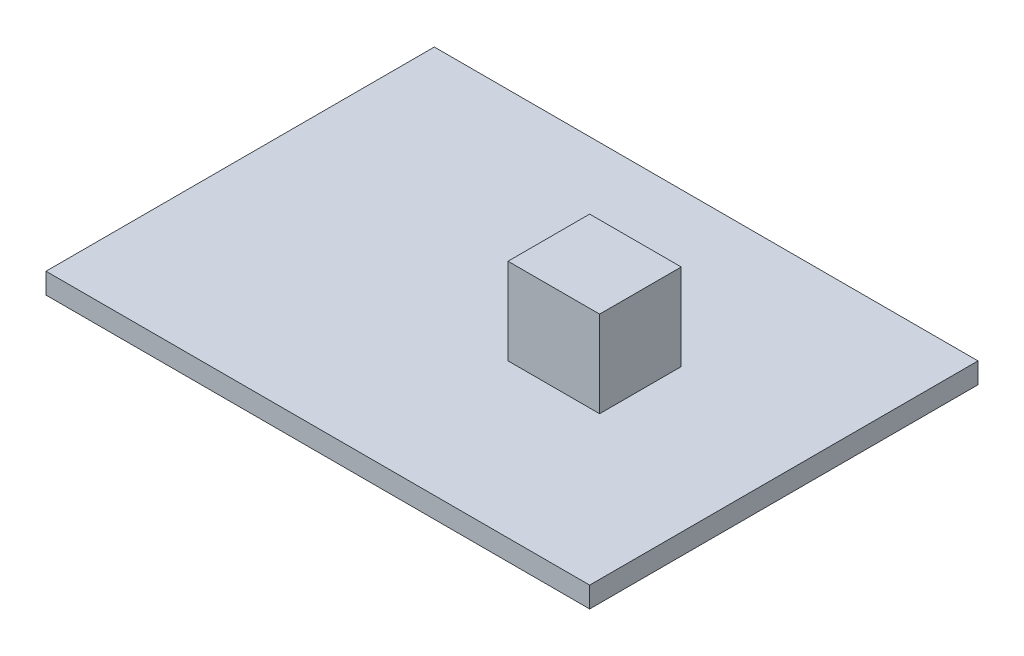
ISO-10303-21;
HEADER;
FILE_DESCRIPTION(('STEP AP214'),'2;1');
FILE_NAME('part.step','',(''),(''),'','','');
FILE_SCHEMA(('AUTOMOTIVE_DESIGN { 1 0 10303 214 1 1 1 1 }'));
ENDSEC;
DATA;
#1=APPLICATION_CONTEXT('core data for automotive mechanical design processes');
#2=APPLICATION_PROTOCOL_DEFINITION('international standard','automotive_design',2000,#1);
#3=PRODUCT_CONTEXT('',#1,'mechanical');
#4=PRODUCT('Part','Part','',(#3));
#5=PRODUCT_RELATED_PRODUCT_CATEGORY('part','',(#4));
#6=PRODUCT_DEFINITION_FORMATION('','',#4);
#7=PRODUCT_DEFINITION_CONTEXT('part definition',#1,'design');
#8=PRODUCT_DEFINITION('design','',#6,#7);
#9=PRODUCT_DEFINITION_SHAPE('','',#8);
#10=(LENGTH_UNIT() NAMED_UNIT(*) SI_UNIT(.MILLI.,.METRE.));
#11=(NAMED_UNIT(*) PLANE_ANGLE_UNIT() SI_UNIT($,.RADIAN.));
#12=(NAMED_UNIT(*) SI_UNIT($,.STERADIAN.) SOLID_ANGLE_UNIT());
#13=UNCERTAINTY_MEASURE_WITH_UNIT(LENGTH_MEASURE(1.E-05),#10,'distance_accuracy_value','');
#14=(GEOMETRIC_REPRESENTATION_CONTEXT(3) GLOBAL_UNCERTAINTY_ASSIGNED_CONTEXT((#13)) GLOBAL_UNIT_ASSIGNED_CONTEXT((#10,
#11,#12)) REPRESENTATION_CONTEXT('',''));
#15=CARTESIAN_POINT('',(0.,0.,0.));
#16=DIRECTION('',(0.,0.,1.));
#17=DIRECTION('',(1.,0.,0.));
#18=AXIS2_PLACEMENT_3D('',#15,#16,#17);
#19=CARTESIAN_POINT('',(-35.9213114754098,2.4,-23.));
#20=DIRECTION('',(1.,0.,0.));
#21=DIRECTION('',(0.,0.,-1.));
#22=AXIS2_PLACEMENT_3D('',#19,#20,#21);
#23=PLANE('',#22);
#24=DIRECTION('',(0.,0.,1.));
#25=VECTOR('',#24,1.);
#26=CARTESIAN_POINT('',(-35.9213114754098,0.,-23.));
#27=LINE('',#26,#25);
#28=CARTESIAN_POINT('',(-35.9213114754098,0.,-23.));
#29=VERTEX_POINT('',#28);
#30=CARTESIAN_POINT('',(-35.9213114754098,0.,22.));
#31=VERTEX_POINT('',#30);
#32=EDGE_CURVE('E117',#29,#31,#27,.T.);
#33=ORIENTED_EDGE('',*,*,#32,.T.);
#34=DIRECTION('',(0.,-1.,0.));
#35=VECTOR('',#34,1.);
#36=CARTESIAN_POINT('',(-35.9213114754098,2.4,22.));
#37=LINE('',#36,#35);
#38=CARTESIAN_POINT('',(-35.9213114754098,2.4,22.));
#39=VERTEX_POINT('',#38);
#40=EDGE_CURVE('E11',#39,#31,#37,.T.);
#41=ORIENTED_EDGE('',*,*,#40,.F.);
#42=DIRECTION('',(0.,0.,1.));
#43=VECTOR('',#42,1.);
#44=CARTESIAN_POINT('',(-35.9213114754098,2.4,-23.));
#45=LINE('',#44,#43);
#46=CARTESIAN_POINT('',(-35.9213114754098,2.4,-23.));
#47=VERTEX_POINT('',#46);
#48=EDGE_CURVE('E126',#47,#39,#45,.T.);
#49=ORIENTED_EDGE('',*,*,#48,.F.);
#50=DIRECTION('',(0.,-1.,0.));
#51=VECTOR('',#50,1.);
#52=CARTESIAN_POINT('',(-35.9213114754098,2.4,-23.));
#53=LINE('',#52,#51);
#54=EDGE_CURVE('E135',#47,#29,#53,.T.);
#55=ORIENTED_EDGE('',*,*,#54,.T.);
#56=EDGE_LOOP('',(#33,#41,#49,#55));
#57=FACE_BOUND('',#56,.T.);
#58=ADVANCED_FACE('F33',(#57),#23,.F.);
#59=CARTESIAN_POINT('',(-35.9213114754098,2.4,22.));
#60=DIRECTION('',(0.,0.,-1.));
#61=DIRECTION('',(-1.,0.,0.));
#62=AXIS2_PLACEMENT_3D('',#59,#60,#61);
#63=PLANE('',#62);
#64=DIRECTION('',(1.,0.,0.));
#65=VECTOR('',#64,1.);
#66=CARTESIAN_POINT('',(-35.9213114754098,0.,22.));
#67=LINE('',#66,#65);
#68=CARTESIAN_POINT('',(27.0786885245902,0.,22.));
#69=VERTEX_POINT('',#68);
#70=EDGE_CURVE('E120',#31,#69,#67,.T.);
#71=ORIENTED_EDGE('',*,*,#70,.T.);
#72=DIRECTION('',(0.,-1.,0.));
#73=VECTOR('',#72,1.);
#74=CARTESIAN_POINT('',(27.0786885245902,2.4,22.));
#75=LINE('',#74,#73);
#76=CARTESIAN_POINT('',(27.0786885245902,2.4,22.));
#77=VERTEX_POINT('',#76);
#78=EDGE_CURVE('E40',#77,#69,#75,.T.);
#79=ORIENTED_EDGE('',*,*,#78,.F.);
#80=DIRECTION('',(1.,0.,0.));
#81=VECTOR('',#80,1.);
#82=CARTESIAN_POINT('',(-35.9213114754098,2.4,22.));
#83=LINE('',#82,#81);
#84=EDGE_CURVE('E129',#39,#77,#83,.T.);
#85=ORIENTED_EDGE('',*,*,#84,.F.);
#86=ORIENTED_EDGE('',*,*,#40,.T.);
#87=EDGE_LOOP('',(#71,#79,#85,#86));
#88=FACE_BOUND('',#87,.T.);
#89=ADVANCED_FACE('F166',(#88),#63,.F.);
#90=CARTESIAN_POINT('',(27.0786885245902,2.4,-23.));
#91=DIRECTION('',(-1.,0.,0.));
#92=DIRECTION('',(0.,0.,1.));
#93=AXIS2_PLACEMENT_3D('',#90,#91,#92);
#94=PLANE('',#93);
#95=DIRECTION('',(0.,0.,-1.));
#96=VECTOR('',#95,1.);
#97=CARTESIAN_POINT('',(27.0786885245902,0.,-23.));
#98=LINE('',#97,#96);
#99=CARTESIAN_POINT('',(27.0786885245902,0.,-23.));
#100=VERTEX_POINT('',#99);
#101=EDGE_CURVE('E138',#69,#100,#98,.T.);
#102=ORIENTED_EDGE('',*,*,#101,.T.);
#103=DIRECTION('',(0.,-1.,0.));
#104=VECTOR('',#103,1.);
#105=CARTESIAN_POINT('',(27.0786885245902,2.4,-23.));
#106=LINE('',#105,#104);
#107=CARTESIAN_POINT('',(27.0786885245902,2.4,-23.));
#108=VERTEX_POINT('',#107);
#109=EDGE_CURVE('E143',#108,#100,#106,.T.);
#110=ORIENTED_EDGE('',*,*,#109,.F.);
#111=DIRECTION('',(0.,0.,-1.));
#112=VECTOR('',#111,1.);
#113=CARTESIAN_POINT('',(27.0786885245902,2.4,-23.));
#114=LINE('',#113,#112);
#115=EDGE_CURVE('E132',#77,#108,#114,.T.);
#116=ORIENTED_EDGE('',*,*,#115,.F.);
#117=ORIENTED_EDGE('',*,*,#78,.T.);
#118=EDGE_LOOP('',(#102,#110,#116,#117));
#119=FACE_BOUND('',#118,.T.);
#120=ADVANCED_FACE('F150',(#119),#94,.F.);
#121=CARTESIAN_POINT('',(-35.9213114754098,2.4,-23.));
#122=DIRECTION('',(0.,0.,1.));
#123=DIRECTION('',(1.,0.,0.));
#124=AXIS2_PLACEMENT_3D('',#121,#122,#123);
#125=PLANE('',#124);
#126=DIRECTION('',(-1.,0.,0.));
#127=VECTOR('',#126,1.);
#128=CARTESIAN_POINT('',(-35.9213114754098,0.,-23.));
#129=LINE('',#128,#127);
#130=EDGE_CURVE('E130',#100,#29,#129,.T.);
#131=ORIENTED_EDGE('',*,*,#130,.T.);
#132=ORIENTED_EDGE('',*,*,#54,.F.);
#133=DIRECTION('',(-1.,0.,0.));
#134=VECTOR('',#133,1.);
#135=CARTESIAN_POINT('',(-35.9213114754098,2.4,-23.));
#136=LINE('',#135,#134);
#137=EDGE_CURVE('E134',#108,#47,#136,.T.);
#138=ORIENTED_EDGE('',*,*,#137,.F.);
#139=ORIENTED_EDGE('',*,*,#109,.T.);
#140=EDGE_LOOP('',(#131,#132,#138,#139));
#141=FACE_BOUND('',#140,.T.);
#142=ADVANCED_FACE('F159',(#141),#125,.F.);
#143=CARTESIAN_POINT('',(0.,2.4,0.));
#144=DIRECTION('',(0.,1.,0.));
#145=DIRECTION('',(0.,0.,1.));
#146=AXIS2_PLACEMENT_3D('',#143,#144,#145);
#147=PLANE('',#146);
#148=DIRECTION('',(0.,0.,1.));
#149=VECTOR('',#148,1.);
#150=CARTESIAN_POINT('',(-0.15404821185387,2.4,-5.22947610208711));
#151=LINE('',#150,#149);
#152=CARTESIAN_POINT('',(-0.15404821185387,2.4,-5.22947610208711));
#153=VERTEX_POINT('',#152);
#154=CARTESIAN_POINT('',(-0.15404821185387,2.4,4.22947610208712));
#155=VERTEX_POINT('',#154);
#156=EDGE_CURVE('E47',#153,#155,#151,.T.);
#157=ORIENTED_EDGE('',*,*,#156,.F.);
#158=DIRECTION('',(-1.,0.,0.));
#159=VECTOR('',#158,1.);
#160=CARTESIAN_POINT('',(-0.15404821185387,2.4,-5.22947610208711));
#161=LINE('',#160,#159);
#162=CARTESIAN_POINT('',(10.4597311013473,2.4,-5.22947610208711));
#163=VERTEX_POINT('',#162);
#164=EDGE_CURVE('E51',#163,#153,#161,.T.);
#165=ORIENTED_EDGE('',*,*,#164,.F.);
#166=DIRECTION('',(0.,0.,-1.));
#167=VECTOR('',#166,1.);
#168=CARTESIAN_POINT('',(10.4597311013473,2.4,-5.22947610208711));
#169=LINE('',#168,#167);
#170=CARTESIAN_POINT('',(10.4597311013473,2.4,4.22947610208712));
#171=VERTEX_POINT('',#170);
#172=EDGE_CURVE('E260',#171,#163,#169,.T.);
#173=ORIENTED_EDGE('',*,*,#172,.F.);
#174=DIRECTION('',(1.,0.,0.));
#175=VECTOR('',#174,1.);
#176=CARTESIAN_POINT('',(-0.15404821185387,2.4,4.22947610208712));
#177=LINE('',#176,#175);
#178=EDGE_CURVE('E266',#155,#171,#177,.T.);
#179=ORIENTED_EDGE('',*,*,#178,.F.);
#180=EDGE_LOOP('',(#157,#165,#173,#179));
#181=FACE_BOUND('',#180,.T.);
#182=ORIENTED_EDGE('',*,*,#48,.T.);
#183=ORIENTED_EDGE('',*,*,#84,.T.);
#184=ORIENTED_EDGE('',*,*,#115,.T.);
#185=ORIENTED_EDGE('',*,*,#137,.T.);
#186=EDGE_LOOP('',(#182,#183,#184,#185));
#187=FACE_BOUND('',#186,.T.);
#188=ADVANCED_FACE('F165',(#181,#187),#147,.T.);
#189=CARTESIAN_POINT('',(0.,0.,0.));
#190=DIRECTION('',(0.,1.,0.));
#191=DIRECTION('',(0.,0.,1.));
#192=AXIS2_PLACEMENT_3D('',#189,#190,#191);
#193=PLANE('',#192);
#194=ORIENTED_EDGE('',*,*,#32,.F.);
#195=ORIENTED_EDGE('',*,*,#130,.F.);
#196=ORIENTED_EDGE('',*,*,#101,.F.);
#197=ORIENTED_EDGE('',*,*,#70,.F.);
#198=EDGE_LOOP('',(#194,#195,#196,#197));
#199=FACE_BOUND('',#198,.T.);
#200=ADVANCED_FACE('F156',(#199),#193,.F.);
#201=CARTESIAN_POINT('',(-0.15404821185387,12.4,-5.22947610208711));
#202=DIRECTION('',(1.,0.,0.));
#203=DIRECTION('',(0.,0.,-1.));
#204=AXIS2_PLACEMENT_3D('',#201,#202,#203);
#205=PLANE('',#204);
#206=ORIENTED_EDGE('',*,*,#156,.T.);
#207=DIRECTION('',(0.,-1.,0.));
#208=VECTOR('',#207,1.);
#209=CARTESIAN_POINT('',(-0.15404821185387,12.4,4.22947610208712));
#210=LINE('',#209,#208);
#211=CARTESIAN_POINT('',(-0.15404821185387,12.4,4.22947610208712));
#212=VERTEX_POINT('',#211);
#213=EDGE_CURVE('E100',#212,#155,#210,.T.);
#214=ORIENTED_EDGE('',*,*,#213,.F.);
#215=DIRECTION('',(0.,0.,1.));
#216=VECTOR('',#215,1.);
#217=CARTESIAN_POINT('',(-0.15404821185387,12.4,-5.22947610208711));
#218=LINE('',#217,#216);
#219=CARTESIAN_POINT('',(-0.15404821185387,12.4,-5.22947610208711));
#220=VERTEX_POINT('',#219);
#221=EDGE_CURVE('E106',#220,#212,#218,.T.);
#222=ORIENTED_EDGE('',*,*,#221,.F.);
#223=DIRECTION('',(0.,-1.,0.));
#224=VECTOR('',#223,1.);
#225=CARTESIAN_POINT('',(-0.15404821185387,12.4,-5.22947610208711));
#226=LINE('',#225,#224);
#227=EDGE_CURVE('E258',#220,#153,#226,.T.);
#228=ORIENTED_EDGE('',*,*,#227,.T.);
#229=EDGE_LOOP('',(#206,#214,#222,#228));
#230=FACE_BOUND('',#229,.T.);
#231=ADVANCED_FACE('F116',(#230),#205,.F.);
#232=CARTESIAN_POINT('',(-0.15404821185387,12.4,4.22947610208712));
#233=DIRECTION('',(0.,0.,-1.));
#234=DIRECTION('',(-1.,0.,0.));
#235=AXIS2_PLACEMENT_3D('',#232,#233,#234);
#236=PLANE('',#235);
#237=ORIENTED_EDGE('',*,*,#178,.T.);
#238=DIRECTION('',(0.,-1.,0.));
#239=VECTOR('',#238,1.);
#240=CARTESIAN_POINT('',(10.4597311013473,12.4,4.22947610208712));
#241=LINE('',#240,#239);
#242=CARTESIAN_POINT('',(10.4597311013473,12.4,4.22947610208712));
#243=VERTEX_POINT('',#242);
#244=EDGE_CURVE('E102',#243,#171,#241,.T.);
#245=ORIENTED_EDGE('',*,*,#244,.F.);
#246=DIRECTION('',(1.,0.,0.));
#247=VECTOR('',#246,1.);
#248=CARTESIAN_POINT('',(-0.15404821185387,12.4,4.22947610208712));
#249=LINE('',#248,#247);
#250=EDGE_CURVE('E95',#212,#243,#249,.T.);
#251=ORIENTED_EDGE('',*,*,#250,.F.);
#252=ORIENTED_EDGE('',*,*,#213,.T.);
#253=EDGE_LOOP('',(#237,#245,#251,#252));
#254=FACE_BOUND('',#253,.T.);
#255=ADVANCED_FACE('F98',(#254),#236,.F.);
#256=CARTESIAN_POINT('',(10.4597311013473,12.4,-5.22947610208711));
#257=DIRECTION('',(-1.,0.,0.));
#258=DIRECTION('',(0.,0.,1.));
#259=AXIS2_PLACEMENT_3D('',#256,#257,#258);
#260=PLANE('',#259);
#261=ORIENTED_EDGE('',*,*,#172,.T.);
#262=DIRECTION('',(0.,-1.,0.));
#263=VECTOR('',#262,1.);
#264=CARTESIAN_POINT('',(10.4597311013473,12.4,-5.22947610208711));
#265=LINE('',#264,#263);
#266=CARTESIAN_POINT('',(10.4597311013473,12.4,-5.22947610208711));
#267=VERTEX_POINT('',#266);
#268=EDGE_CURVE('E122',#267,#163,#265,.T.);
#269=ORIENTED_EDGE('',*,*,#268,.F.);
#270=DIRECTION('',(0.,0.,-1.));
#271=VECTOR('',#270,1.);
#272=CARTESIAN_POINT('',(10.4597311013473,12.4,-5.22947610208711));
#273=LINE('',#272,#271);
#274=EDGE_CURVE('E105',#243,#267,#273,.T.);
#275=ORIENTED_EDGE('',*,*,#274,.F.);
#276=ORIENTED_EDGE('',*,*,#244,.T.);
#277=EDGE_LOOP('',(#261,#269,#275,#276));
#278=FACE_BOUND('',#277,.T.);
#279=ADVANCED_FACE('F184',(#278),#260,.F.);
#280=CARTESIAN_POINT('',(-0.15404821185387,12.4,-5.22947610208711));
#281=DIRECTION('',(0.,0.,1.));
#282=DIRECTION('',(1.,0.,0.));
#283=AXIS2_PLACEMENT_3D('',#280,#281,#282);
#284=PLANE('',#283);
#285=ORIENTED_EDGE('',*,*,#164,.T.);
#286=ORIENTED_EDGE('',*,*,#227,.F.);
#287=DIRECTION('',(-1.,0.,0.));
#288=VECTOR('',#287,1.);
#289=CARTESIAN_POINT('',(-0.15404821185387,12.4,-5.22947610208711));
#290=LINE('',#289,#288);
#291=EDGE_CURVE('E111',#267,#220,#290,.T.);
#292=ORIENTED_EDGE('',*,*,#291,.F.);
#293=ORIENTED_EDGE('',*,*,#268,.T.);
#294=EDGE_LOOP('',(#285,#286,#292,#293));
#295=FACE_BOUND('',#294,.T.);
#296=ADVANCED_FACE('F187',(#295),#284,.F.);
#297=CARTESIAN_POINT('',(0.,12.4,0.));
#298=DIRECTION('',(0.,1.,0.));
#299=DIRECTION('',(0.,0.,1.));
#300=AXIS2_PLACEMENT_3D('',#297,#298,#299);
#301=PLANE('',#300);
#302=ORIENTED_EDGE('',*,*,#221,.T.);
#303=ORIENTED_EDGE('',*,*,#250,.T.);
#304=ORIENTED_EDGE('',*,*,#274,.T.);
#305=ORIENTED_EDGE('',*,*,#291,.T.);
#306=EDGE_LOOP('',(#302,#303,#304,#305));
#307=FACE_BOUND('',#306,.T.);
#308=ADVANCED_FACE('F109',(#307),#301,.T.);
#309=CLOSED_SHELL('',(#58,#89,#120,#142,#188,#200,#231,#255,#279,#296,#308));
#310=MANIFOLD_SOLID_BREP('B2',#309);
#311=ADVANCED_BREP_SHAPE_REPRESENTATION('',(#18,#310),#14);
#312=SHAPE_DEFINITION_REPRESENTATION(#9,#311);
ENDSEC;
END-ISO-10303-21;
